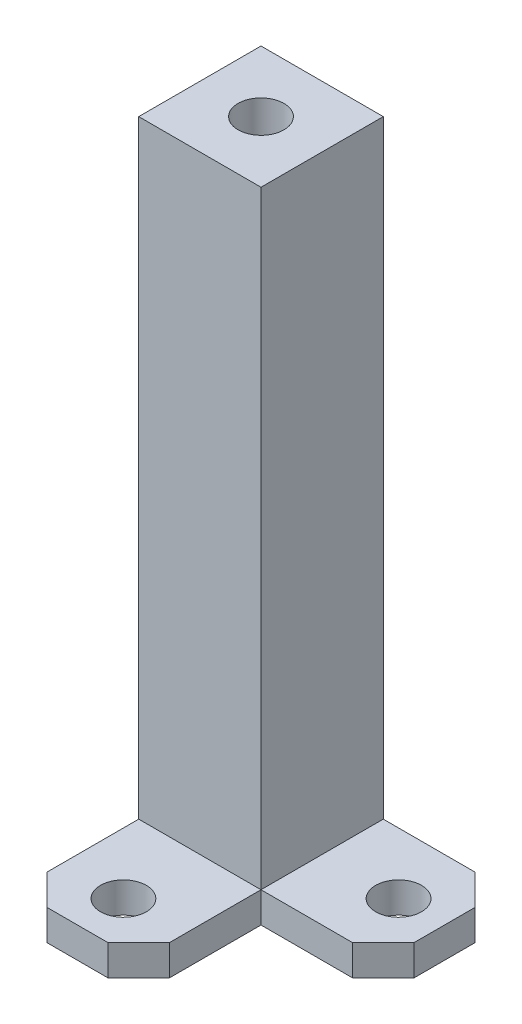
ISO-10303-21;
HEADER;
FILE_DESCRIPTION(('STEP AP214'),'2;1');
FILE_NAME('part.step','',(''),(''),'','','');
FILE_SCHEMA(('AUTOMOTIVE_DESIGN { 1 0 10303 214 1 1 1 1 }'));
ENDSEC;
DATA;
#1=APPLICATION_CONTEXT('core data for automotive mechanical design processes');
#2=APPLICATION_PROTOCOL_DEFINITION('international standard','automotive_design',2000,#1);
#3=PRODUCT_CONTEXT('',#1,'mechanical');
#4=PRODUCT('Part','Part','',(#3));
#5=PRODUCT_RELATED_PRODUCT_CATEGORY('part','',(#4));
#6=PRODUCT_DEFINITION_FORMATION('','',#4);
#7=PRODUCT_DEFINITION_CONTEXT('part definition',#1,'design');
#8=PRODUCT_DEFINITION('design','',#6,#7);
#9=PRODUCT_DEFINITION_SHAPE('','',#8);
#10=(LENGTH_UNIT() NAMED_UNIT(*) SI_UNIT(.MILLI.,.METRE.));
#11=(NAMED_UNIT(*) PLANE_ANGLE_UNIT() SI_UNIT($,.RADIAN.));
#12=(NAMED_UNIT(*) SI_UNIT($,.STERADIAN.) SOLID_ANGLE_UNIT());
#13=UNCERTAINTY_MEASURE_WITH_UNIT(LENGTH_MEASURE(1.E-05),#10,'distance_accuracy_value','');
#14=(GEOMETRIC_REPRESENTATION_CONTEXT(3) GLOBAL_UNCERTAINTY_ASSIGNED_CONTEXT((#13)) GLOBAL_UNIT_ASSIGNED_CONTEXT((#10,
#11,#12)) REPRESENTATION_CONTEXT('',''));
#15=CARTESIAN_POINT('',(0.,0.,0.));
#16=DIRECTION('',(0.,0.,1.));
#17=DIRECTION('',(1.,0.,0.));
#18=AXIS2_PLACEMENT_3D('',#15,#16,#17);
#19=CARTESIAN_POINT('',(0.,41.8,0.));
#20=DIRECTION('',(0.,0.,-1.));
#21=DIRECTION('',(-1.,0.,0.));
#22=AXIS2_PLACEMENT_3D('',#19,#20,#21);
#23=PLANE('',#22);
#24=DIRECTION('',(-1.,0.,0.));
#25=VECTOR('',#24,1.);
#26=CARTESIAN_POINT('',(0.,2.,0.));
#27=LINE('',#26,#25);
#28=CARTESIAN_POINT('',(8.,2.,0.));
#29=VERTEX_POINT('',#28);
#30=CARTESIAN_POINT('',(0.,2.,0.));
#31=VERTEX_POINT('',#30);
#32=EDGE_CURVE('E148',#29,#31,#27,.T.);
#33=ORIENTED_EDGE('',*,*,#32,.F.);
#34=DIRECTION('',(0.,-1.,0.));
#35=VECTOR('',#34,1.);
#36=CARTESIAN_POINT('',(8.,41.8,0.));
#37=LINE('',#36,#35);
#38=CARTESIAN_POINT('',(8.,41.8,0.));
#39=VERTEX_POINT('',#38);
#40=EDGE_CURVE('E169',#39,#29,#37,.T.);
#41=ORIENTED_EDGE('',*,*,#40,.F.);
#42=DIRECTION('',(1.,0.,0.));
#43=VECTOR('',#42,1.);
#44=CARTESIAN_POINT('',(0.,41.8,0.));
#45=LINE('',#44,#43);
#46=CARTESIAN_POINT('',(0.,41.8,0.));
#47=VERTEX_POINT('',#46);
#48=EDGE_CURVE('E210',#47,#39,#45,.T.);
#49=ORIENTED_EDGE('',*,*,#48,.F.);
#50=DIRECTION('',(0.,-1.,0.));
#51=VECTOR('',#50,1.);
#52=CARTESIAN_POINT('',(0.,41.8,0.));
#53=LINE('',#52,#51);
#54=EDGE_CURVE('E171',#47,#31,#53,.T.);
#55=ORIENTED_EDGE('',*,*,#54,.T.);
#56=EDGE_LOOP('',(#33,#41,#49,#55));
#57=FACE_BOUND('',#56,.T.);
#58=ADVANCED_FACE('F46',(#57),#23,.F.);
#59=CARTESIAN_POINT('',(8.,41.8,0.));
#60=DIRECTION('',(-1.,0.,0.));
#61=DIRECTION('',(0.,0.,1.));
#62=AXIS2_PLACEMENT_3D('',#59,#60,#61);
#63=PLANE('',#62);
#64=DIRECTION('',(0.,0.,1.));
#65=VECTOR('',#64,1.);
#66=CARTESIAN_POINT('',(8.,2.,0.));
#67=LINE('',#66,#65);
#68=CARTESIAN_POINT('',(8.,2.,-8.));
#69=VERTEX_POINT('',#68);
#70=EDGE_CURVE('E177',#69,#29,#67,.T.);
#71=ORIENTED_EDGE('',*,*,#70,.F.);
#72=DIRECTION('',(0.,-1.,0.));
#73=VECTOR('',#72,1.);
#74=CARTESIAN_POINT('',(8.,41.8,-8.));
#75=LINE('',#74,#73);
#76=CARTESIAN_POINT('',(8.,41.8,-8.));
#77=VERTEX_POINT('',#76);
#78=EDGE_CURVE('E182',#77,#69,#75,.T.);
#79=ORIENTED_EDGE('',*,*,#78,.F.);
#80=DIRECTION('',(0.,0.,-1.));
#81=VECTOR('',#80,1.);
#82=CARTESIAN_POINT('',(8.,41.8,0.));
#83=LINE('',#82,#81);
#84=EDGE_CURVE('E176',#39,#77,#83,.T.);
#85=ORIENTED_EDGE('',*,*,#84,.F.);
#86=ORIENTED_EDGE('',*,*,#40,.T.);
#87=EDGE_LOOP('',(#71,#79,#85,#86));
#88=FACE_BOUND('',#87,.T.);
#89=ADVANCED_FACE('F174',(#88),#63,.F.);
#90=CARTESIAN_POINT('',(0.,41.8,0.));
#91=DIRECTION('',(1.,0.,0.));
#92=DIRECTION('',(0.,0.,-1.));
#93=AXIS2_PLACEMENT_3D('',#90,#91,#92);
#94=PLANE('',#93);
#95=DIRECTION('',(0.,0.,1.));
#96=VECTOR('',#95,1.);
#97=CARTESIAN_POINT('',(0.,0.,0.));
#98=LINE('',#97,#96);
#99=CARTESIAN_POINT('',(0.,0.,-8.));
#100=VERTEX_POINT('',#99);
#101=CARTESIAN_POINT('',(0.,0.,5.99999999999999));
#102=VERTEX_POINT('',#101);
#103=EDGE_CURVE('E203',#100,#102,#98,.T.);
#104=ORIENTED_EDGE('',*,*,#103,.T.);
#105=DIRECTION('',(0.,1.,0.));
#106=VECTOR('',#105,1.);
#107=CARTESIAN_POINT('',(0.,41.8,5.99999999999999));
#108=LINE('',#107,#106);
#109=CARTESIAN_POINT('',(0.,2.,5.99999999999999));
#110=VERTEX_POINT('',#109);
#111=EDGE_CURVE('E237',#102,#110,#108,.T.);
#112=ORIENTED_EDGE('',*,*,#111,.T.);
#113=DIRECTION('',(0.,0.,1.));
#114=VECTOR('',#113,1.);
#115=CARTESIAN_POINT('',(0.,2.,0.));
#116=LINE('',#115,#114);
#117=EDGE_CURVE('E277',#31,#110,#116,.T.);
#118=ORIENTED_EDGE('',*,*,#117,.F.);
#119=ORIENTED_EDGE('',*,*,#54,.F.);
#120=DIRECTION('',(0.,0.,1.));
#121=VECTOR('',#120,1.);
#122=CARTESIAN_POINT('',(0.,41.8,0.));
#123=LINE('',#122,#121);
#124=CARTESIAN_POINT('',(0.,41.8,-8.));
#125=VERTEX_POINT('',#124);
#126=EDGE_CURVE('E204',#125,#47,#123,.T.);
#127=ORIENTED_EDGE('',*,*,#126,.F.);
#128=DIRECTION('',(0.,-1.,0.));
#129=VECTOR('',#128,1.);
#130=CARTESIAN_POINT('',(0.,41.8,-8.));
#131=LINE('',#130,#129);
#132=EDGE_CURVE('E213',#125,#100,#131,.T.);
#133=ORIENTED_EDGE('',*,*,#132,.T.);
#134=EDGE_LOOP('',(#104,#112,#118,#119,#127,#133));
#135=FACE_BOUND('',#134,.T.);
#136=ADVANCED_FACE('F267',(#135),#94,.F.);
#137=DIRECTION('',(1.,0.,0.));
#138=VECTOR('',#137,1.);
#139=CARTESIAN_POINT('',(0.,0.,0.));
#140=LINE('',#139,#138);
#141=CARTESIAN_POINT('',(8.,0.,0.));
#142=VERTEX_POINT('',#141);
#143=CARTESIAN_POINT('',(14.,0.,0.));
#144=VERTEX_POINT('',#143);
#145=EDGE_CURVE('E216',#142,#144,#140,.T.);
#146=ORIENTED_EDGE('',*,*,#145,.T.);
#147=DIRECTION('',(0.,1.,0.));
#148=VECTOR('',#147,1.);
#149=CARTESIAN_POINT('',(14.,41.8,0.));
#150=LINE('',#149,#148);
#151=CARTESIAN_POINT('',(14.,2.,0.));
#152=VERTEX_POINT('',#151);
#153=EDGE_CURVE('E66',#144,#152,#150,.T.);
#154=ORIENTED_EDGE('',*,*,#153,.T.);
#155=DIRECTION('',(1.,0.,0.));
#156=VECTOR('',#155,1.);
#157=CARTESIAN_POINT('',(8.,2.,0.));
#158=LINE('',#157,#156);
#159=EDGE_CURVE('E181',#29,#152,#158,.T.);
#160=ORIENTED_EDGE('',*,*,#159,.F.);
#161=DIRECTION('',(0.,-1.,0.));
#162=VECTOR('',#161,1.);
#163=CARTESIAN_POINT('',(8.,2.,0.));
#164=LINE('',#163,#162);
#165=EDGE_CURVE('E160',#29,#142,#164,.T.);
#166=ORIENTED_EDGE('',*,*,#165,.T.);
#167=EDGE_LOOP('',(#146,#154,#160,#166));
#168=FACE_BOUND('',#167,.T.);
#169=ADVANCED_FACE('F184',(#168),#23,.F.);
#170=CARTESIAN_POINT('',(0.,41.8,-8.));
#171=DIRECTION('',(0.,0.,1.));
#172=DIRECTION('',(1.,0.,0.));
#173=AXIS2_PLACEMENT_3D('',#170,#171,#172);
#174=PLANE('',#173);
#175=DIRECTION('',(-1.,0.,0.));
#176=VECTOR('',#175,1.);
#177=CARTESIAN_POINT('',(8.,2.,-8.));
#178=LINE('',#177,#176);
#179=CARTESIAN_POINT('',(14.,2.,-8.));
#180=VERTEX_POINT('',#179);
#181=EDGE_CURVE('E188',#180,#69,#178,.T.);
#182=ORIENTED_EDGE('',*,*,#181,.F.);
#183=DIRECTION('',(0.,-1.,0.));
#184=VECTOR('',#183,1.);
#185=CARTESIAN_POINT('',(14.,41.8,-8.));
#186=LINE('',#185,#184);
#187=CARTESIAN_POINT('',(14.,0.,-8.));
#188=VERTEX_POINT('',#187);
#189=EDGE_CURVE('E11',#180,#188,#186,.T.);
#190=ORIENTED_EDGE('',*,*,#189,.T.);
#191=DIRECTION('',(-1.,0.,0.));
#192=VECTOR('',#191,1.);
#193=CARTESIAN_POINT('',(0.,0.,-8.));
#194=LINE('',#193,#192);
#195=EDGE_CURVE('E208',#188,#100,#194,.T.);
#196=ORIENTED_EDGE('',*,*,#195,.T.);
#197=ORIENTED_EDGE('',*,*,#132,.F.);
#198=DIRECTION('',(-1.,0.,0.));
#199=VECTOR('',#198,1.);
#200=CARTESIAN_POINT('',(0.,41.8,-8.));
#201=LINE('',#200,#199);
#202=EDGE_CURVE('E211',#77,#125,#201,.T.);
#203=ORIENTED_EDGE('',*,*,#202,.F.);
#204=ORIENTED_EDGE('',*,*,#78,.T.);
#205=EDGE_LOOP('',(#182,#190,#196,#197,#203,#204));
#206=FACE_BOUND('',#205,.T.);
#207=ADVANCED_FACE('F262',(#206),#174,.F.);
#208=CARTESIAN_POINT('',(0.,41.8,0.));
#209=DIRECTION('',(0.,-1.,0.));
#210=DIRECTION('',(0.,0.,-1.));
#211=AXIS2_PLACEMENT_3D('',#208,#209,#210);
#212=PLANE('',#211);
#213=CARTESIAN_POINT('',(4.,41.8,-4.));
#214=DIRECTION('',(0.,1.,0.));
#215=DIRECTION('',(0.,0.,1.));
#216=AXIS2_PLACEMENT_3D('',#213,#214,#215);
#217=CIRCLE('',#216,1.5);
#218=CARTESIAN_POINT('',(4.,41.8,-2.5));
#219=VERTEX_POINT('',#218);
#220=EDGE_CURVE('E198',#219,#219,#217,.T.);
#221=ORIENTED_EDGE('',*,*,#220,.F.);
#222=EDGE_LOOP('',(#221));
#223=FACE_BOUND('',#222,.T.);
#224=ORIENTED_EDGE('',*,*,#126,.T.);
#225=ORIENTED_EDGE('',*,*,#48,.T.);
#226=ORIENTED_EDGE('',*,*,#84,.T.);
#227=ORIENTED_EDGE('',*,*,#202,.T.);
#228=EDGE_LOOP('',(#224,#225,#226,#227));
#229=FACE_BOUND('',#228,.T.);
#230=ADVANCED_FACE('F334',(#223,#229),#212,.F.);
#231=CARTESIAN_POINT('',(0.,0.,0.));
#232=DIRECTION('',(0.,-1.,0.));
#233=DIRECTION('',(0.,0.,-1.));
#234=AXIS2_PLACEMENT_3D('',#231,#232,#233);
#235=PLANE('',#234);
#236=CARTESIAN_POINT('',(4.,0.,5.));
#237=DIRECTION('',(0.,1.,0.));
#238=DIRECTION('',(0.,0.,1.));
#239=AXIS2_PLACEMENT_3D('',#236,#237,#238);
#240=CIRCLE('',#239,1.5);
#241=CARTESIAN_POINT('',(4.,0.,6.5));
#242=VERTEX_POINT('',#241);
#243=EDGE_CURVE('E288',#242,#242,#240,.T.);
#244=ORIENTED_EDGE('',*,*,#243,.T.);
#245=EDGE_LOOP('',(#244));
#246=FACE_BOUND('',#245,.T.);
#247=CARTESIAN_POINT('',(13.,0.,-4.));
#248=DIRECTION('',(0.,1.,0.));
#249=DIRECTION('',(0.,0.,1.));
#250=AXIS2_PLACEMENT_3D('',#247,#248,#249);
#251=CIRCLE('',#250,1.5);
#252=CARTESIAN_POINT('',(13.,0.,-2.5));
#253=VERTEX_POINT('',#252);
#254=EDGE_CURVE('E300',#253,#253,#251,.T.);
#255=ORIENTED_EDGE('',*,*,#254,.T.);
#256=EDGE_LOOP('',(#255));
#257=FACE_BOUND('',#256,.T.);
#258=DIRECTION('',(1.,0.,0.));
#259=VECTOR('',#258,1.);
#260=CARTESIAN_POINT('',(0.,0.,8.));
#261=LINE('',#260,#259);
#262=CARTESIAN_POINT('',(2.,0.,8.));
#263=VERTEX_POINT('',#262);
#264=CARTESIAN_POINT('',(6.,0.,8.));
#265=VERTEX_POINT('',#264);
#266=EDGE_CURVE('E284',#263,#265,#261,.T.);
#267=ORIENTED_EDGE('',*,*,#266,.F.);
#268=DIRECTION('',(0.707106781186546,0.,0.707106781186549));
#269=VECTOR('',#268,1.);
#270=CARTESIAN_POINT('',(-3.,0.,2.99999999999999));
#271=LINE('',#270,#269);
#272=EDGE_CURVE('E235',#263,#102,#271,.F.);
#273=ORIENTED_EDGE('',*,*,#272,.T.);
#274=ORIENTED_EDGE('',*,*,#103,.F.);
#275=ORIENTED_EDGE('',*,*,#195,.F.);
#276=DIRECTION('',(-0.707106781186546,0.,-0.707106781186549));
#277=VECTOR('',#276,1.);
#278=CARTESIAN_POINT('',(11.,0.,-11.));
#279=LINE('',#278,#277);
#280=CARTESIAN_POINT('',(16.,0.,-5.99999999999999));
#281=VERTEX_POINT('',#280);
#282=EDGE_CURVE('E227',#188,#281,#279,.F.);
#283=ORIENTED_EDGE('',*,*,#282,.T.);
#284=DIRECTION('',(0.,0.,-1.));
#285=VECTOR('',#284,1.);
#286=CARTESIAN_POINT('',(16.,0.,0.));
#287=LINE('',#286,#285);
#288=CARTESIAN_POINT('',(16.,0.,-2.));
#289=VERTEX_POINT('',#288);
#290=EDGE_CURVE('E165',#289,#281,#287,.T.);
#291=ORIENTED_EDGE('',*,*,#290,.F.);
#292=DIRECTION('',(0.707106781186549,0.,-0.707106781186546));
#293=VECTOR('',#292,1.);
#294=CARTESIAN_POINT('',(6.99999999999997,0.,7.));
#295=LINE('',#294,#293);
#296=EDGE_CURVE('E229',#289,#144,#295,.F.);
#297=ORIENTED_EDGE('',*,*,#296,.T.);
#298=ORIENTED_EDGE('',*,*,#145,.F.);
#299=DIRECTION('',(0.,0.,-1.));
#300=VECTOR('',#299,1.);
#301=CARTESIAN_POINT('',(8.,0.,0.));
#302=LINE('',#301,#300);
#303=CARTESIAN_POINT('',(8.,0.,6.));
#304=VERTEX_POINT('',#303);
#305=EDGE_CURVE('E159',#304,#142,#302,.T.);
#306=ORIENTED_EDGE('',*,*,#305,.F.);
#307=DIRECTION('',(0.707106781186548,0.,-0.707106781186548));
#308=VECTOR('',#307,1.);
#309=CARTESIAN_POINT('',(7.,0.,7.));
#310=LINE('',#309,#308);
#311=EDGE_CURVE('E234',#304,#265,#310,.F.);
#312=ORIENTED_EDGE('',*,*,#311,.T.);
#313=EDGE_LOOP('',(#267,#273,#274,#275,#283,#291,#297,#298,#306,#312));
#314=FACE_BOUND('',#313,.T.);
#315=ADVANCED_FACE('F259',(#246,#257,#314),#235,.T.);
#316=CARTESIAN_POINT('',(4.,37.8,-4.));
#317=DIRECTION('',(0.,1.,0.));
#318=DIRECTION('',(0.,0.,1.));
#319=AXIS2_PLACEMENT_3D('',#316,#317,#318);
#320=CYLINDRICAL_SURFACE('',#319,1.5);
#321=CARTESIAN_POINT('',(4.,37.8,-4.));
#322=DIRECTION('',(0.,1.,0.));
#323=DIRECTION('',(0.,0.,1.));
#324=AXIS2_PLACEMENT_3D('',#321,#322,#323);
#325=CIRCLE('',#324,1.5);
#326=CARTESIAN_POINT('',(4.,37.8,-2.5));
#327=VERTEX_POINT('',#326);
#328=EDGE_CURVE('E196',#327,#327,#325,.T.);
#329=ORIENTED_EDGE('',*,*,#328,.F.);
#330=EDGE_LOOP('',(#329));
#331=FACE_BOUND('',#330,.T.);
#332=ORIENTED_EDGE('',*,*,#220,.T.);
#333=EDGE_LOOP('',(#332));
#334=FACE_BOUND('',#333,.T.);
#335=ADVANCED_FACE('F442',(#331,#334),#320,.F.);
#336=CARTESIAN_POINT('',(4.,37.8,-4.));
#337=DIRECTION('',(0.,1.,0.));
#338=DIRECTION('',(0.,0.,1.));
#339=AXIS2_PLACEMENT_3D('',#336,#337,#338);
#340=PLANE('',#339);
#341=ORIENTED_EDGE('',*,*,#328,.T.);
#342=EDGE_LOOP('',(#341));
#343=FACE_BOUND('',#342,.T.);
#344=ADVANCED_FACE('F318',(#343),#340,.T.);
#345=CARTESIAN_POINT('',(16.,2.,0.));
#346=DIRECTION('',(-1.,0.,0.));
#347=DIRECTION('',(0.,0.,1.));
#348=AXIS2_PLACEMENT_3D('',#345,#346,#347);
#349=PLANE('',#348);
#350=DIRECTION('',(0.,0.,-1.));
#351=VECTOR('',#350,1.);
#352=CARTESIAN_POINT('',(16.,2.,0.));
#353=LINE('',#352,#351);
#354=CARTESIAN_POINT('',(16.,2.,-2.));
#355=VERTEX_POINT('',#354);
#356=CARTESIAN_POINT('',(16.,2.,-5.99999999999999));
#357=VERTEX_POINT('',#356);
#358=EDGE_CURVE('E186',#355,#357,#353,.T.);
#359=ORIENTED_EDGE('',*,*,#358,.F.);
#360=DIRECTION('',(0.,-1.,0.));
#361=VECTOR('',#360,1.);
#362=CARTESIAN_POINT('',(16.,2.,-2.));
#363=LINE('',#362,#361);
#364=EDGE_CURVE('E244',#355,#289,#363,.T.);
#365=ORIENTED_EDGE('',*,*,#364,.T.);
#366=ORIENTED_EDGE('',*,*,#290,.T.);
#367=DIRECTION('',(0.,1.,0.));
#368=VECTOR('',#367,1.);
#369=CARTESIAN_POINT('',(16.,2.,-5.99999999999999));
#370=LINE('',#369,#368);
#371=EDGE_CURVE('E242',#281,#357,#370,.T.);
#372=ORIENTED_EDGE('',*,*,#371,.T.);
#373=EDGE_LOOP('',(#359,#365,#366,#372));
#374=FACE_BOUND('',#373,.T.);
#375=ADVANCED_FACE('F251',(#374),#349,.F.);
#376=CARTESIAN_POINT('',(0.,2.,0.));
#377=DIRECTION('',(0.,-1.,0.));
#378=DIRECTION('',(0.,0.,-1.));
#379=AXIS2_PLACEMENT_3D('',#376,#377,#378);
#380=PLANE('',#379);
#381=CARTESIAN_POINT('',(13.,2.,-4.));
#382=DIRECTION('',(0.,1.,0.));
#383=DIRECTION('',(0.,0.,1.));
#384=AXIS2_PLACEMENT_3D('',#381,#382,#383);
#385=CIRCLE('',#384,1.5);
#386=CARTESIAN_POINT('',(13.,2.,-2.5));
#387=VERTEX_POINT('',#386);
#388=EDGE_CURVE('E291',#387,#387,#385,.T.);
#389=ORIENTED_EDGE('',*,*,#388,.F.);
#390=EDGE_LOOP('',(#389));
#391=FACE_BOUND('',#390,.T.);
#392=ORIENTED_EDGE('',*,*,#159,.T.);
#393=DIRECTION('',(-0.707106781186549,0.,0.707106781186546));
#394=VECTOR('',#393,1.);
#395=CARTESIAN_POINT('',(16.,2.,-2.));
#396=LINE('',#395,#394);
#397=EDGE_CURVE('E54',#152,#355,#396,.F.);
#398=ORIENTED_EDGE('',*,*,#397,.T.);
#399=ORIENTED_EDGE('',*,*,#358,.T.);
#400=DIRECTION('',(0.707106781186546,0.,0.707106781186549));
#401=VECTOR('',#400,1.);
#402=CARTESIAN_POINT('',(14.,2.,-8.));
#403=LINE('',#402,#401);
#404=EDGE_CURVE('E65',#357,#180,#403,.F.);
#405=ORIENTED_EDGE('',*,*,#404,.T.);
#406=ORIENTED_EDGE('',*,*,#181,.T.);
#407=ORIENTED_EDGE('',*,*,#70,.T.);
#408=EDGE_LOOP('',(#392,#398,#399,#405,#406,#407));
#409=FACE_BOUND('',#408,.T.);
#410=ADVANCED_FACE('F187',(#391,#409),#380,.F.);
#411=CARTESIAN_POINT('',(0.,2.,8.));
#412=DIRECTION('',(0.,0.,-1.));
#413=DIRECTION('',(-1.,0.,0.));
#414=AXIS2_PLACEMENT_3D('',#411,#412,#413);
#415=PLANE('',#414);
#416=DIRECTION('',(1.,0.,0.));
#417=VECTOR('',#416,1.);
#418=CARTESIAN_POINT('',(0.,2.,8.));
#419=LINE('',#418,#417);
#420=CARTESIAN_POINT('',(2.,2.,8.));
#421=VERTEX_POINT('',#420);
#422=CARTESIAN_POINT('',(6.,2.,8.));
#423=VERTEX_POINT('',#422);
#424=EDGE_CURVE('E152',#421,#423,#419,.T.);
#425=ORIENTED_EDGE('',*,*,#424,.F.);
#426=DIRECTION('',(0.,-1.,0.));
#427=VECTOR('',#426,1.);
#428=CARTESIAN_POINT('',(2.,2.,8.));
#429=LINE('',#428,#427);
#430=EDGE_CURVE('E223',#421,#263,#429,.T.);
#431=ORIENTED_EDGE('',*,*,#430,.T.);
#432=ORIENTED_EDGE('',*,*,#266,.T.);
#433=DIRECTION('',(0.,1.,0.));
#434=VECTOR('',#433,1.);
#435=CARTESIAN_POINT('',(6.,2.,8.));
#436=LINE('',#435,#434);
#437=EDGE_CURVE('E224',#265,#423,#436,.T.);
#438=ORIENTED_EDGE('',*,*,#437,.T.);
#439=EDGE_LOOP('',(#425,#431,#432,#438));
#440=FACE_BOUND('',#439,.T.);
#441=ADVANCED_FACE('F279',(#440),#415,.F.);
#442=CARTESIAN_POINT('',(8.,2.,0.));
#443=DIRECTION('',(-1.,0.,0.));
#444=DIRECTION('',(0.,0.,1.));
#445=AXIS2_PLACEMENT_3D('',#442,#443,#444);
#446=PLANE('',#445);
#447=DIRECTION('',(0.,0.,-1.));
#448=VECTOR('',#447,1.);
#449=CARTESIAN_POINT('',(8.,2.,0.));
#450=LINE('',#449,#448);
#451=CARTESIAN_POINT('',(8.,2.,6.));
#452=VERTEX_POINT('',#451);
#453=EDGE_CURVE('E143',#452,#29,#450,.T.);
#454=ORIENTED_EDGE('',*,*,#453,.F.);
#455=DIRECTION('',(0.,-1.,0.));
#456=VECTOR('',#455,1.);
#457=CARTESIAN_POINT('',(8.,2.,6.));
#458=LINE('',#457,#456);
#459=EDGE_CURVE('E241',#452,#304,#458,.T.);
#460=ORIENTED_EDGE('',*,*,#459,.T.);
#461=ORIENTED_EDGE('',*,*,#305,.T.);
#462=ORIENTED_EDGE('',*,*,#165,.F.);
#463=EDGE_LOOP('',(#454,#460,#461,#462));
#464=FACE_BOUND('',#463,.T.);
#465=ADVANCED_FACE('F158',(#464),#446,.F.);
#466=CARTESIAN_POINT('',(0.,2.,0.));
#467=DIRECTION('',(0.,1.,0.));
#468=DIRECTION('',(0.,0.,1.));
#469=AXIS2_PLACEMENT_3D('',#466,#467,#468);
#470=PLANE('',#469);
#471=CARTESIAN_POINT('',(4.,2.,5.));
#472=DIRECTION('',(0.,1.,0.));
#473=DIRECTION('',(0.,0.,1.));
#474=AXIS2_PLACEMENT_3D('',#471,#472,#473);
#475=CIRCLE('',#474,1.5);
#476=CARTESIAN_POINT('',(4.,2.,6.5));
#477=VERTEX_POINT('',#476);
#478=EDGE_CURVE('E287',#477,#477,#475,.T.);
#479=ORIENTED_EDGE('',*,*,#478,.F.);
#480=EDGE_LOOP('',(#479));
#481=FACE_BOUND('',#480,.T.);
#482=ORIENTED_EDGE('',*,*,#117,.T.);
#483=DIRECTION('',(-0.707106781186546,0.,-0.707106781186549));
#484=VECTOR('',#483,1.);
#485=CARTESIAN_POINT('',(-3.,2.,2.99999999999999));
#486=LINE('',#485,#484);
#487=EDGE_CURVE('E239',#110,#421,#486,.F.);
#488=ORIENTED_EDGE('',*,*,#487,.T.);
#489=ORIENTED_EDGE('',*,*,#424,.T.);
#490=DIRECTION('',(-0.707106781186548,0.,0.707106781186548));
#491=VECTOR('',#490,1.);
#492=CARTESIAN_POINT('',(7.,2.,7.));
#493=LINE('',#492,#491);
#494=EDGE_CURVE('E147',#423,#452,#493,.F.);
#495=ORIENTED_EDGE('',*,*,#494,.T.);
#496=ORIENTED_EDGE('',*,*,#453,.T.);
#497=ORIENTED_EDGE('',*,*,#32,.T.);
#498=EDGE_LOOP('',(#482,#488,#489,#495,#496,#497));
#499=FACE_BOUND('',#498,.T.);
#500=ADVANCED_FACE('F145',(#481,#499),#470,.T.);
#501=CARTESIAN_POINT('',(2.,2.,8.));
#502=DIRECTION('',(0.707106781186549,0.,-0.707106781186546));
#503=DIRECTION('',(0.,-1.,0.));
#504=AXIS2_PLACEMENT_3D('',#501,#502,#503);
#505=PLANE('',#504);
#506=ORIENTED_EDGE('',*,*,#487,.F.);
#507=ORIENTED_EDGE('',*,*,#111,.F.);
#508=ORIENTED_EDGE('',*,*,#272,.F.);
#509=ORIENTED_EDGE('',*,*,#430,.F.);
#510=EDGE_LOOP('',(#506,#507,#508,#509));
#511=FACE_BOUND('',#510,.T.);
#512=ADVANCED_FACE('F272',(#511),#505,.F.);
#513=CARTESIAN_POINT('',(8.,2.,6.));
#514=DIRECTION('',(-0.707106781186547,0.,-0.707106781186547));
#515=DIRECTION('',(0.,-1.,0.));
#516=AXIS2_PLACEMENT_3D('',#513,#514,#515);
#517=PLANE('',#516);
#518=ORIENTED_EDGE('',*,*,#494,.F.);
#519=ORIENTED_EDGE('',*,*,#437,.F.);
#520=ORIENTED_EDGE('',*,*,#311,.F.);
#521=ORIENTED_EDGE('',*,*,#459,.F.);
#522=EDGE_LOOP('',(#518,#519,#520,#521));
#523=FACE_BOUND('',#522,.T.);
#524=ADVANCED_FACE('F345',(#523),#517,.F.);
#525=CARTESIAN_POINT('',(16.,2.,-2.));
#526=DIRECTION('',(-0.707106781186546,0.,-0.707106781186549));
#527=DIRECTION('',(0.,-1.,0.));
#528=AXIS2_PLACEMENT_3D('',#525,#526,#527);
#529=PLANE('',#528);
#530=ORIENTED_EDGE('',*,*,#397,.F.);
#531=ORIENTED_EDGE('',*,*,#153,.F.);
#532=ORIENTED_EDGE('',*,*,#296,.F.);
#533=ORIENTED_EDGE('',*,*,#364,.F.);
#534=EDGE_LOOP('',(#530,#531,#532,#533));
#535=FACE_BOUND('',#534,.T.);
#536=ADVANCED_FACE('F258',(#535),#529,.F.);
#537=CARTESIAN_POINT('',(14.,41.8,-8.));
#538=DIRECTION('',(-0.707106781186549,0.,0.707106781186546));
#539=DIRECTION('',(0.,-1.,0.));
#540=AXIS2_PLACEMENT_3D('',#537,#538,#539);
#541=PLANE('',#540);
#542=ORIENTED_EDGE('',*,*,#404,.F.);
#543=ORIENTED_EDGE('',*,*,#371,.F.);
#544=ORIENTED_EDGE('',*,*,#282,.F.);
#545=ORIENTED_EDGE('',*,*,#189,.F.);
#546=EDGE_LOOP('',(#542,#543,#544,#545));
#547=FACE_BOUND('',#546,.T.);
#548=ADVANCED_FACE('F47',(#547),#541,.F.);
#549=CARTESIAN_POINT('',(4.,0.,5.));
#550=DIRECTION('',(0.,1.,0.));
#551=DIRECTION('',(0.,0.,1.));
#552=AXIS2_PLACEMENT_3D('',#549,#550,#551);
#553=CYLINDRICAL_SURFACE('',#552,1.5);
#554=ORIENTED_EDGE('',*,*,#243,.F.);
#555=EDGE_LOOP('',(#554));
#556=FACE_BOUND('',#555,.T.);
#557=ORIENTED_EDGE('',*,*,#478,.T.);
#558=EDGE_LOOP('',(#557));
#559=FACE_BOUND('',#558,.T.);
#560=ADVANCED_FACE('F301',(#556,#559),#553,.F.);
#561=CARTESIAN_POINT('',(13.,0.,-4.));
#562=DIRECTION('',(0.,1.,0.));
#563=DIRECTION('',(0.,0.,1.));
#564=AXIS2_PLACEMENT_3D('',#561,#562,#563);
#565=CYLINDRICAL_SURFACE('',#564,1.5);
#566=ORIENTED_EDGE('',*,*,#254,.F.);
#567=EDGE_LOOP('',(#566));
#568=FACE_BOUND('',#567,.T.);
#569=ORIENTED_EDGE('',*,*,#388,.T.);
#570=EDGE_LOOP('',(#569));
#571=FACE_BOUND('',#570,.T.);
#572=ADVANCED_FACE('F304',(#568,#571),#565,.F.);
#573=CLOSED_SHELL('',(#58,#89,#136,#169,#207,#230,#315,#335,#344,#375,#410,#441,#465,#500,#512,
#524,#536,#548,#560,#572));
#574=MANIFOLD_SOLID_BREP('B2',#573);
#575=ADVANCED_BREP_SHAPE_REPRESENTATION('',(#18,#574),#14);
#576=SHAPE_DEFINITION_REPRESENTATION(#9,#575);
ENDSEC;
END-ISO-10303-21;
